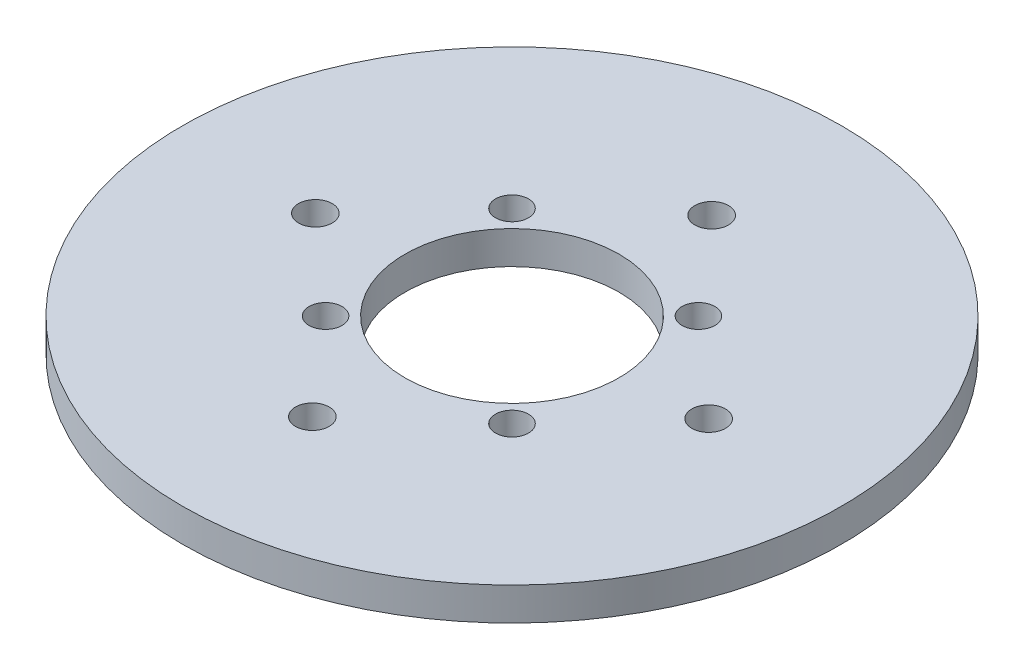
ISO-10303-21;
HEADER;
FILE_DESCRIPTION(('STEP AP214'),'2;1');
FILE_NAME('part.step','',(''),(''),'','','');
FILE_SCHEMA(('AUTOMOTIVE_DESIGN { 1 0 10303 214 1 1 1 1 }'));
ENDSEC;
DATA;
#1=APPLICATION_CONTEXT('core data for automotive mechanical design processes');
#2=APPLICATION_PROTOCOL_DEFINITION('international standard','automotive_design',2000,#1);
#3=PRODUCT_CONTEXT('',#1,'mechanical');
#4=PRODUCT('Part','Part','',(#3));
#5=PRODUCT_RELATED_PRODUCT_CATEGORY('part','',(#4));
#6=PRODUCT_DEFINITION_FORMATION('','',#4);
#7=PRODUCT_DEFINITION_CONTEXT('part definition',#1,'design');
#8=PRODUCT_DEFINITION('design','',#6,#7);
#9=PRODUCT_DEFINITION_SHAPE('','',#8);
#10=(LENGTH_UNIT() NAMED_UNIT(*) SI_UNIT(.MILLI.,.METRE.));
#11=(NAMED_UNIT(*) PLANE_ANGLE_UNIT() SI_UNIT($,.RADIAN.));
#12=(NAMED_UNIT(*) SI_UNIT($,.STERADIAN.) SOLID_ANGLE_UNIT());
#13=UNCERTAINTY_MEASURE_WITH_UNIT(LENGTH_MEASURE(1.E-05),#10,'distance_accuracy_value','');
#14=(GEOMETRIC_REPRESENTATION_CONTEXT(3) GLOBAL_UNCERTAINTY_ASSIGNED_CONTEXT((#13)) GLOBAL_UNIT_ASSIGNED_CONTEXT((#10,
#11,#12)) REPRESENTATION_CONTEXT('',''));
#15=CARTESIAN_POINT('',(0.,0.,0.));
#16=DIRECTION('',(0.,0.,1.));
#17=DIRECTION('',(1.,0.,0.));
#18=AXIS2_PLACEMENT_3D('',#15,#16,#17);
#19=CARTESIAN_POINT('',(0.,6.35,0.));
#20=DIRECTION('',(0.,-1.,0.));
#21=DIRECTION('',(0.,0.,-1.));
#22=AXIS2_PLACEMENT_3D('',#19,#20,#21);
#23=CYLINDRICAL_SURFACE('',#22,63.5);
#24=CARTESIAN_POINT('',(0.,6.35,0.));
#25=DIRECTION('',(0.,1.,0.));
#26=DIRECTION('',(0.,0.,1.));
#27=AXIS2_PLACEMENT_3D('',#24,#25,#26);
#28=CIRCLE('',#27,63.5);
#29=CARTESIAN_POINT('',(0.,6.35,63.5));
#30=VERTEX_POINT('',#29);
#31=EDGE_CURVE('E10',#30,#30,#28,.T.);
#32=ORIENTED_EDGE('',*,*,#31,.F.);
#33=EDGE_LOOP('',(#32));
#34=FACE_BOUND('',#33,.T.);
#35=CARTESIAN_POINT('',(0.,0.,0.));
#36=DIRECTION('',(0.,1.,0.));
#37=DIRECTION('',(0.,0.,1.));
#38=AXIS2_PLACEMENT_3D('',#35,#36,#37);
#39=CIRCLE('',#38,63.5);
#40=CARTESIAN_POINT('',(0.,0.,63.5));
#41=VERTEX_POINT('',#40);
#42=EDGE_CURVE('E41',#41,#41,#39,.T.);
#43=ORIENTED_EDGE('',*,*,#42,.T.);
#44=EDGE_LOOP('',(#43));
#45=FACE_BOUND('',#44,.T.);
#46=ADVANCED_FACE('F38',(#34,#45),#23,.T.);
#47=CARTESIAN_POINT('',(0.,6.35,0.));
#48=DIRECTION('',(0.,1.,0.));
#49=DIRECTION('',(0.,0.,1.));
#50=AXIS2_PLACEMENT_3D('',#47,#48,#49);
#51=PLANE('',#50);
#52=CARTESIAN_POINT('',(-36.0792820253825,6.35,1.81256959395013));
#53=DIRECTION('',(0.,1.,0.));
#54=DIRECTION('',(0.,0.,1.));
#55=AXIS2_PLACEMENT_3D('',#52,#53,#54);
#56=CIRCLE('',#55,3.25);
#57=CARTESIAN_POINT('',(-36.0792820253825,6.35,5.06256959395013));
#58=VERTEX_POINT('',#57);
#59=EDGE_CURVE('E98',#58,#58,#56,.T.);
#60=ORIENTED_EDGE('',*,*,#59,.F.);
#61=EDGE_LOOP('',(#60));
#62=FACE_BOUND('',#61,.T.);
#63=CARTESIAN_POINT('',(2.42991567519093,6.35,-36.0429675500154));
#64=DIRECTION('',(0.,1.,0.));
#65=DIRECTION('',(0.,0.,1.));
#66=AXIS2_PLACEMENT_3D('',#63,#64,#65);
#67=CIRCLE('',#66,3.25);
#68=CARTESIAN_POINT('',(2.42991567519093,6.35,-32.7929675500154));
#69=VERTEX_POINT('',#68);
#70=EDGE_CURVE('E92',#69,#69,#67,.T.);
#71=ORIENTED_EDGE('',*,*,#70,.F.);
#72=EDGE_LOOP('',(#71));
#73=FACE_BOUND('',#72,.T.);
#74=CARTESIAN_POINT('',(36.0792820253825,6.35,-1.81256959395013));
#75=DIRECTION('',(0.,1.,0.));
#76=DIRECTION('',(0.,0.,1.));
#77=AXIS2_PLACEMENT_3D('',#74,#75,#76);
#78=CIRCLE('',#77,3.25);
#79=CARTESIAN_POINT('',(36.0792820253825,6.35,1.43743040604987));
#80=VERTEX_POINT('',#79);
#81=EDGE_CURVE('E86',#80,#80,#78,.T.);
#82=ORIENTED_EDGE('',*,*,#81,.F.);
#83=EDGE_LOOP('',(#82));
#84=FACE_BOUND('',#83,.T.);
#85=CARTESIAN_POINT('',(-2.42991567519091,6.35,36.0429675500154));
#86=DIRECTION('',(0.,1.,0.));
#87=DIRECTION('',(0.,0.,1.));
#88=AXIS2_PLACEMENT_3D('',#85,#86,#87);
#89=CIRCLE('',#88,3.25);
#90=CARTESIAN_POINT('',(-2.42991567519091,6.35,39.2929675500154));
#91=VERTEX_POINT('',#90);
#92=EDGE_CURVE('E80',#91,#91,#89,.T.);
#93=ORIENTED_EDGE('',*,*,#92,.F.);
#94=EDGE_LOOP('',(#93));
#95=FACE_BOUND('',#94,.T.);
#96=CARTESIAN_POINT('',(-17.9605122421383,6.35,17.9605122421383));
#97=DIRECTION('',(0.,1.,0.));
#98=DIRECTION('',(0.,0.,1.));
#99=AXIS2_PLACEMENT_3D('',#96,#97,#98);
#100=CIRCLE('',#99,3.175);
#101=CARTESIAN_POINT('',(-17.9605122421383,6.35,21.1355122421383));
#102=VERTEX_POINT('',#101);
#103=EDGE_CURVE('E62',#102,#102,#100,.T.);
#104=ORIENTED_EDGE('',*,*,#103,.F.);
#105=EDGE_LOOP('',(#104));
#106=FACE_BOUND('',#105,.T.);
#107=CARTESIAN_POINT('',(17.9605122421383,6.35,17.9605122421383));
#108=DIRECTION('',(0.,1.,0.));
#109=DIRECTION('',(0.,0.,1.));
#110=AXIS2_PLACEMENT_3D('',#107,#108,#109);
#111=CIRCLE('',#110,3.175);
#112=CARTESIAN_POINT('',(17.9605122421383,6.35,21.1355122421383));
#113=VERTEX_POINT('',#112);
#114=EDGE_CURVE('E69',#113,#113,#111,.T.);
#115=ORIENTED_EDGE('',*,*,#114,.F.);
#116=EDGE_LOOP('',(#115));
#117=FACE_BOUND('',#116,.T.);
#118=CARTESIAN_POINT('',(17.9605122421383,6.35,-17.9605122421383));
#119=DIRECTION('',(0.,1.,0.));
#120=DIRECTION('',(0.,0.,1.));
#121=AXIS2_PLACEMENT_3D('',#118,#119,#120);
#122=CIRCLE('',#121,3.175);
#123=CARTESIAN_POINT('',(17.9605122421383,6.35,-14.7855122421383));
#124=VERTEX_POINT('',#123);
#125=EDGE_CURVE('E75',#124,#124,#122,.T.);
#126=ORIENTED_EDGE('',*,*,#125,.F.);
#127=EDGE_LOOP('',(#126));
#128=FACE_BOUND('',#127,.T.);
#129=CARTESIAN_POINT('',(-17.9605122421383,6.35,-17.9605122421383));
#130=DIRECTION('',(0.,1.,0.));
#131=DIRECTION('',(0.,0.,1.));
#132=AXIS2_PLACEMENT_3D('',#129,#130,#131);
#133=CIRCLE('',#132,3.175);
#134=CARTESIAN_POINT('',(-17.9605122421383,6.35,-14.7855122421383));
#135=VERTEX_POINT('',#134);
#136=EDGE_CURVE('E56',#135,#135,#133,.T.);
#137=ORIENTED_EDGE('',*,*,#136,.F.);
#138=EDGE_LOOP('',(#137));
#139=FACE_BOUND('',#138,.T.);
#140=CARTESIAN_POINT('',(0.,6.35,0.));
#141=DIRECTION('',(0.,1.,0.));
#142=DIRECTION('',(0.,0.,1.));
#143=AXIS2_PLACEMENT_3D('',#140,#141,#142);
#144=CIRCLE('',#143,20.6375);
#145=CARTESIAN_POINT('',(0.,6.35,20.6375));
#146=VERTEX_POINT('',#145);
#147=EDGE_CURVE('E50',#146,#146,#144,.T.);
#148=ORIENTED_EDGE('',*,*,#147,.F.);
#149=EDGE_LOOP('',(#148));
#150=FACE_BOUND('',#149,.T.);
#151=ORIENTED_EDGE('',*,*,#31,.T.);
#152=EDGE_LOOP('',(#151));
#153=FACE_BOUND('',#152,.T.);
#154=ADVANCED_FACE('F114',(#62,#73,#84,#95,#106,#117,#128,#139,#150,#153),#51,.T.);
#155=CARTESIAN_POINT('',(0.,0.,0.));
#156=DIRECTION('',(0.,1.,0.));
#157=DIRECTION('',(0.,0.,1.));
#158=AXIS2_PLACEMENT_3D('',#155,#156,#157);
#159=PLANE('',#158);
#160=CARTESIAN_POINT('',(-36.0792820253825,0.,1.81256959395013));
#161=DIRECTION('',(0.,1.,0.));
#162=DIRECTION('',(0.,0.,1.));
#163=AXIS2_PLACEMENT_3D('',#160,#161,#162);
#164=CIRCLE('',#163,3.25);
#165=CARTESIAN_POINT('',(-36.0792820253825,0.,5.06256959395013));
#166=VERTEX_POINT('',#165);
#167=EDGE_CURVE('E66',#166,#166,#164,.T.);
#168=ORIENTED_EDGE('',*,*,#167,.T.);
#169=EDGE_LOOP('',(#168));
#170=FACE_BOUND('',#169,.T.);
#171=CARTESIAN_POINT('',(2.42991567519093,0.,-36.0429675500154));
#172=DIRECTION('',(0.,1.,0.));
#173=DIRECTION('',(0.,0.,1.));
#174=AXIS2_PLACEMENT_3D('',#171,#172,#173);
#175=CIRCLE('',#174,3.25);
#176=CARTESIAN_POINT('',(2.42991567519093,0.,-32.7929675500154));
#177=VERTEX_POINT('',#176);
#178=EDGE_CURVE('E95',#177,#177,#175,.T.);
#179=ORIENTED_EDGE('',*,*,#178,.T.);
#180=EDGE_LOOP('',(#179));
#181=FACE_BOUND('',#180,.T.);
#182=CARTESIAN_POINT('',(36.0792820253825,0.,-1.81256959395013));
#183=DIRECTION('',(0.,1.,0.));
#184=DIRECTION('',(0.,0.,1.));
#185=AXIS2_PLACEMENT_3D('',#182,#183,#184);
#186=CIRCLE('',#185,3.25);
#187=CARTESIAN_POINT('',(36.0792820253825,0.,1.43743040604987));
#188=VERTEX_POINT('',#187);
#189=EDGE_CURVE('E89',#188,#188,#186,.T.);
#190=ORIENTED_EDGE('',*,*,#189,.T.);
#191=EDGE_LOOP('',(#190));
#192=FACE_BOUND('',#191,.T.);
#193=CARTESIAN_POINT('',(-2.42991567519091,0.,36.0429675500154));
#194=DIRECTION('',(0.,1.,0.));
#195=DIRECTION('',(0.,0.,1.));
#196=AXIS2_PLACEMENT_3D('',#193,#194,#195);
#197=CIRCLE('',#196,3.25);
#198=CARTESIAN_POINT('',(-2.42991567519091,0.,39.2929675500154));
#199=VERTEX_POINT('',#198);
#200=EDGE_CURVE('E83',#199,#199,#197,.T.);
#201=ORIENTED_EDGE('',*,*,#200,.T.);
#202=EDGE_LOOP('',(#201));
#203=FACE_BOUND('',#202,.T.);
#204=CARTESIAN_POINT('',(-17.9605122421383,0.,17.9605122421383));
#205=DIRECTION('',(0.,1.,0.));
#206=DIRECTION('',(0.,0.,1.));
#207=AXIS2_PLACEMENT_3D('',#204,#205,#206);
#208=CIRCLE('',#207,3.175);
#209=CARTESIAN_POINT('',(-17.9605122421383,0.,21.1355122421383));
#210=VERTEX_POINT('',#209);
#211=EDGE_CURVE('E65',#210,#210,#208,.T.);
#212=ORIENTED_EDGE('',*,*,#211,.T.);
#213=EDGE_LOOP('',(#212));
#214=FACE_BOUND('',#213,.T.);
#215=CARTESIAN_POINT('',(17.9605122421383,0.,17.9605122421383));
#216=DIRECTION('',(0.,1.,0.));
#217=DIRECTION('',(0.,0.,1.));
#218=AXIS2_PLACEMENT_3D('',#215,#216,#217);
#219=CIRCLE('',#218,3.175);
#220=CARTESIAN_POINT('',(17.9605122421383,0.,21.1355122421383));
#221=VERTEX_POINT('',#220);
#222=EDGE_CURVE('E72',#221,#221,#219,.T.);
#223=ORIENTED_EDGE('',*,*,#222,.T.);
#224=EDGE_LOOP('',(#223));
#225=FACE_BOUND('',#224,.T.);
#226=CARTESIAN_POINT('',(17.9605122421383,0.,-17.9605122421383));
#227=DIRECTION('',(0.,1.,0.));
#228=DIRECTION('',(0.,0.,1.));
#229=AXIS2_PLACEMENT_3D('',#226,#227,#228);
#230=CIRCLE('',#229,3.175);
#231=CARTESIAN_POINT('',(17.9605122421383,0.,-14.7855122421383));
#232=VERTEX_POINT('',#231);
#233=EDGE_CURVE('E59',#232,#232,#230,.T.);
#234=ORIENTED_EDGE('',*,*,#233,.T.);
#235=EDGE_LOOP('',(#234));
#236=FACE_BOUND('',#235,.T.);
#237=CARTESIAN_POINT('',(-17.9605122421383,0.,-17.9605122421383));
#238=DIRECTION('',(0.,1.,0.));
#239=DIRECTION('',(0.,0.,1.));
#240=AXIS2_PLACEMENT_3D('',#237,#238,#239);
#241=CIRCLE('',#240,3.175);
#242=CARTESIAN_POINT('',(-17.9605122421383,0.,-14.7855122421383));
#243=VERTEX_POINT('',#242);
#244=EDGE_CURVE('E53',#243,#243,#241,.T.);
#245=ORIENTED_EDGE('',*,*,#244,.T.);
#246=EDGE_LOOP('',(#245));
#247=FACE_BOUND('',#246,.T.);
#248=CARTESIAN_POINT('',(0.,0.,0.));
#249=DIRECTION('',(0.,1.,0.));
#250=DIRECTION('',(0.,0.,1.));
#251=AXIS2_PLACEMENT_3D('',#248,#249,#250);
#252=CIRCLE('',#251,20.6375);
#253=CARTESIAN_POINT('',(0.,0.,20.6375));
#254=VERTEX_POINT('',#253);
#255=EDGE_CURVE('E48',#254,#254,#252,.T.);
#256=ORIENTED_EDGE('',*,*,#255,.T.);
#257=EDGE_LOOP('',(#256));
#258=FACE_BOUND('',#257,.T.);
#259=ORIENTED_EDGE('',*,*,#42,.F.);
#260=EDGE_LOOP('',(#259));
#261=FACE_BOUND('',#260,.T.);
#262=ADVANCED_FACE('F104',(#170,#181,#192,#203,#214,#225,#236,#247,#258,#261),#159,.F.);
#263=CARTESIAN_POINT('',(0.,0.,0.));
#264=DIRECTION('',(0.,1.,0.));
#265=DIRECTION('',(0.,0.,1.));
#266=AXIS2_PLACEMENT_3D('',#263,#264,#265);
#267=CYLINDRICAL_SURFACE('',#266,20.6375);
#268=ORIENTED_EDGE('',*,*,#255,.F.);
#269=EDGE_LOOP('',(#268));
#270=FACE_BOUND('',#269,.T.);
#271=ORIENTED_EDGE('',*,*,#147,.T.);
#272=EDGE_LOOP('',(#271));
#273=FACE_BOUND('',#272,.T.);
#274=ADVANCED_FACE('F134',(#270,#273),#267,.F.);
#275=CARTESIAN_POINT('',(-17.9605122421383,0.,-17.9605122421383));
#276=DIRECTION('',(0.,1.,0.));
#277=DIRECTION('',(0.,0.,1.));
#278=AXIS2_PLACEMENT_3D('',#275,#276,#277);
#279=CYLINDRICAL_SURFACE('',#278,3.175);
#280=ORIENTED_EDGE('',*,*,#244,.F.);
#281=EDGE_LOOP('',(#280));
#282=FACE_BOUND('',#281,.T.);
#283=ORIENTED_EDGE('',*,*,#136,.T.);
#284=EDGE_LOOP('',(#283));
#285=FACE_BOUND('',#284,.T.);
#286=ADVANCED_FACE('F136',(#282,#285),#279,.F.);
#287=CARTESIAN_POINT('',(17.9605122421383,0.,-17.9605122421383));
#288=DIRECTION('',(0.,1.,0.));
#289=DIRECTION('',(0.,0.,1.));
#290=AXIS2_PLACEMENT_3D('',#287,#288,#289);
#291=CYLINDRICAL_SURFACE('',#290,3.175);
#292=ORIENTED_EDGE('',*,*,#233,.F.);
#293=EDGE_LOOP('',(#292));
#294=FACE_BOUND('',#293,.T.);
#295=ORIENTED_EDGE('',*,*,#125,.T.);
#296=EDGE_LOOP('',(#295));
#297=FACE_BOUND('',#296,.T.);
#298=ADVANCED_FACE('F143',(#294,#297),#291,.F.);
#299=CARTESIAN_POINT('',(17.9605122421383,0.,17.9605122421383));
#300=DIRECTION('',(0.,1.,0.));
#301=DIRECTION('',(0.,0.,1.));
#302=AXIS2_PLACEMENT_3D('',#299,#300,#301);
#303=CYLINDRICAL_SURFACE('',#302,3.175);
#304=ORIENTED_EDGE('',*,*,#222,.F.);
#305=EDGE_LOOP('',(#304));
#306=FACE_BOUND('',#305,.T.);
#307=ORIENTED_EDGE('',*,*,#114,.T.);
#308=EDGE_LOOP('',(#307));
#309=FACE_BOUND('',#308,.T.);
#310=ADVANCED_FACE('F211',(#306,#309),#303,.F.);
#311=CARTESIAN_POINT('',(-17.9605122421383,0.,17.9605122421383));
#312=DIRECTION('',(0.,1.,0.));
#313=DIRECTION('',(0.,0.,1.));
#314=AXIS2_PLACEMENT_3D('',#311,#312,#313);
#315=CYLINDRICAL_SURFACE('',#314,3.175);
#316=ORIENTED_EDGE('',*,*,#211,.F.);
#317=EDGE_LOOP('',(#316));
#318=FACE_BOUND('',#317,.T.);
#319=ORIENTED_EDGE('',*,*,#103,.T.);
#320=EDGE_LOOP('',(#319));
#321=FACE_BOUND('',#320,.T.);
#322=ADVANCED_FACE('F175',(#318,#321),#315,.F.);
#323=CARTESIAN_POINT('',(-2.42991567519091,0.,36.0429675500154));
#324=DIRECTION('',(0.,1.,0.));
#325=DIRECTION('',(0.,0.,1.));
#326=AXIS2_PLACEMENT_3D('',#323,#324,#325);
#327=CYLINDRICAL_SURFACE('',#326,3.25);
#328=ORIENTED_EDGE('',*,*,#200,.F.);
#329=EDGE_LOOP('',(#328));
#330=FACE_BOUND('',#329,.T.);
#331=ORIENTED_EDGE('',*,*,#92,.T.);
#332=EDGE_LOOP('',(#331));
#333=FACE_BOUND('',#332,.T.);
#334=ADVANCED_FACE('F169',(#330,#333),#327,.F.);
#335=CARTESIAN_POINT('',(36.0792820253825,0.,-1.81256959395013));
#336=DIRECTION('',(0.,1.,0.));
#337=DIRECTION('',(0.,0.,1.));
#338=AXIS2_PLACEMENT_3D('',#335,#336,#337);
#339=CYLINDRICAL_SURFACE('',#338,3.25);
#340=ORIENTED_EDGE('',*,*,#189,.F.);
#341=EDGE_LOOP('',(#340));
#342=FACE_BOUND('',#341,.T.);
#343=ORIENTED_EDGE('',*,*,#81,.T.);
#344=EDGE_LOOP('',(#343));
#345=FACE_BOUND('',#344,.T.);
#346=ADVANCED_FACE('F174',(#342,#345),#339,.F.);
#347=CARTESIAN_POINT('',(2.42991567519093,0.,-36.0429675500154));
#348=DIRECTION('',(0.,1.,0.));
#349=DIRECTION('',(0.,0.,1.));
#350=AXIS2_PLACEMENT_3D('',#347,#348,#349);
#351=CYLINDRICAL_SURFACE('',#350,3.25);
#352=ORIENTED_EDGE('',*,*,#178,.F.);
#353=EDGE_LOOP('',(#352));
#354=FACE_BOUND('',#353,.T.);
#355=ORIENTED_EDGE('',*,*,#70,.T.);
#356=EDGE_LOOP('',(#355));
#357=FACE_BOUND('',#356,.T.);
#358=ADVANCED_FACE('F110',(#354,#357),#351,.F.);
#359=CARTESIAN_POINT('',(-36.0792820253825,0.,1.81256959395013));
#360=DIRECTION('',(0.,1.,0.));
#361=DIRECTION('',(0.,0.,1.));
#362=AXIS2_PLACEMENT_3D('',#359,#360,#361);
#363=CYLINDRICAL_SURFACE('',#362,3.25);
#364=ORIENTED_EDGE('',*,*,#167,.F.);
#365=EDGE_LOOP('',(#364));
#366=FACE_BOUND('',#365,.T.);
#367=ORIENTED_EDGE('',*,*,#59,.T.);
#368=EDGE_LOOP('',(#367));
#369=FACE_BOUND('',#368,.T.);
#370=ADVANCED_FACE('F107',(#366,#369),#363,.F.);
#371=CLOSED_SHELL('',(#46,#154,#262,#274,#286,#298,#310,#322,#334,#346,#358,#370));
#372=MANIFOLD_SOLID_BREP('B2',#371);
#373=ADVANCED_BREP_SHAPE_REPRESENTATION('',(#18,#372),#14);
#374=SHAPE_DEFINITION_REPRESENTATION(#9,#373);
ENDSEC;
END-ISO-10303-21;
